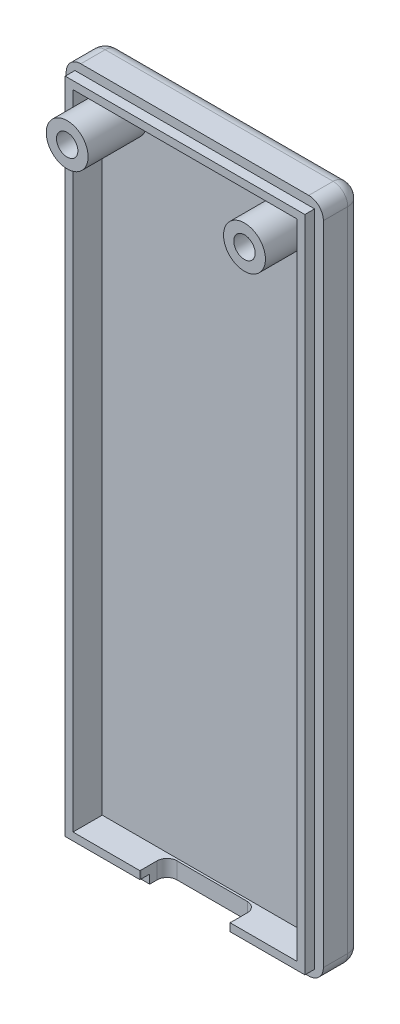
ISO-10303-21;
HEADER;
FILE_DESCRIPTION(('STEP AP214'),'2;1');
FILE_NAME('part.step','',(''),(''),'','','');
FILE_SCHEMA(('AUTOMOTIVE_DESIGN { 1 0 10303 214 1 1 1 1 }'));
ENDSEC;
DATA;
#1=APPLICATION_CONTEXT('core data for automotive mechanical design processes');
#2=APPLICATION_PROTOCOL_DEFINITION('international standard','automotive_design',2000,#1);
#3=PRODUCT_CONTEXT('',#1,'mechanical');
#4=PRODUCT('Part','Part','',(#3));
#5=PRODUCT_RELATED_PRODUCT_CATEGORY('part','',(#4));
#6=PRODUCT_DEFINITION_FORMATION('','',#4);
#7=PRODUCT_DEFINITION_CONTEXT('part definition',#1,'design');
#8=PRODUCT_DEFINITION('design','',#6,#7);
#9=PRODUCT_DEFINITION_SHAPE('','',#8);
#10=(LENGTH_UNIT() NAMED_UNIT(*) SI_UNIT(.MILLI.,.METRE.));
#11=(NAMED_UNIT(*) PLANE_ANGLE_UNIT() SI_UNIT($,.RADIAN.));
#12=(NAMED_UNIT(*) SI_UNIT($,.STERADIAN.) SOLID_ANGLE_UNIT());
#13=UNCERTAINTY_MEASURE_WITH_UNIT(LENGTH_MEASURE(1.E-05),#10,'distance_accuracy_value','');
#14=(GEOMETRIC_REPRESENTATION_CONTEXT(3) GLOBAL_UNCERTAINTY_ASSIGNED_CONTEXT((#13)) GLOBAL_UNIT_ASSIGNED_CONTEXT((#10,
#11,#12)) REPRESENTATION_CONTEXT('',''));
#15=CARTESIAN_POINT('',(0.,0.,0.));
#16=DIRECTION('',(0.,0.,1.));
#17=DIRECTION('',(1.,0.,0.));
#18=AXIS2_PLACEMENT_3D('',#15,#16,#17);
#19=CARTESIAN_POINT('',(0.,-69.4,5.));
#20=DIRECTION('',(0.,1.,0.));
#21=DIRECTION('',(0.,0.,1.));
#22=AXIS2_PLACEMENT_3D('',#19,#20,#21);
#23=PLANE('',#22);
#24=DIRECTION('',(1.,0.,0.));
#25=VECTOR('',#24,1.);
#26=CARTESIAN_POINT('',(0.,-69.4,1.5));
#27=LINE('',#26,#25);
#28=CARTESIAN_POINT('',(1.50000000000001,-69.4,1.5));
#29=VERTEX_POINT('',#28);
#30=CARTESIAN_POINT('',(24.9,-69.4,1.5));
#31=VERTEX_POINT('',#30);
#32=EDGE_CURVE('E462',#29,#31,#27,.T.);
#33=ORIENTED_EDGE('',*,*,#32,.T.);
#34=DIRECTION('',(0.,0.,-1.));
#35=VECTOR('',#34,1.);
#36=CARTESIAN_POINT('',(24.9,-69.4,4.));
#37=LINE('',#36,#35);
#38=CARTESIAN_POINT('',(24.9,-69.4,4.));
#39=VERTEX_POINT('',#38);
#40=EDGE_CURVE('E464',#31,#39,#37,.F.);
#41=ORIENTED_EDGE('',*,*,#40,.T.);
#42=DIRECTION('',(1.,0.,0.));
#43=VECTOR('',#42,1.);
#44=CARTESIAN_POINT('',(0.,-69.4,4.));
#45=LINE('',#44,#43);
#46=CARTESIAN_POINT('',(17.8278234644786,-69.4,4.));
#47=VERTEX_POINT('',#46);
#48=EDGE_CURVE('E309',#47,#39,#45,.T.);
#49=ORIENTED_EDGE('',*,*,#48,.F.);
#50=DIRECTION('',(0.,0.,1.));
#51=VECTOR('',#50,1.);
#52=CARTESIAN_POINT('',(17.8278234644786,-69.4,0.));
#53=LINE('',#52,#51);
#54=CARTESIAN_POINT('',(17.8278234644786,-69.4,3.23600203200449));
#55=VERTEX_POINT('',#54);
#56=EDGE_CURVE('E338',#55,#47,#53,.T.);
#57=ORIENTED_EDGE('',*,*,#56,.F.);
#58=CARTESIAN_POINT('',(16.8118214324742,-69.4,3.23600203200449));
#59=DIRECTION('',(0.,-1.,0.));
#60=DIRECTION('',(0.,0.,-1.));
#61=AXIS2_PLACEMENT_3D('',#58,#59,#60);
#62=CIRCLE('',#61,1.01600203200449);
#63=CARTESIAN_POINT('',(16.8118214324742,-69.4,2.22));
#64=VERTEX_POINT('',#63);
#65=EDGE_CURVE('E335',#64,#55,#62,.T.);
#66=ORIENTED_EDGE('',*,*,#65,.F.);
#67=DIRECTION('',(1.,0.,0.));
#68=VECTOR('',#67,1.);
#69=CARTESIAN_POINT('',(0.,-69.4,2.22));
#70=LINE('',#69,#68);
#71=CARTESIAN_POINT('',(9.58817856752611,-69.4,2.22));
#72=VERTEX_POINT('',#71);
#73=EDGE_CURVE('E332',#72,#64,#70,.T.);
#74=ORIENTED_EDGE('',*,*,#73,.F.);
#75=CARTESIAN_POINT('',(9.58817856752611,-69.4,3.23600203200474));
#76=DIRECTION('',(0.,-1.,0.));
#77=DIRECTION('',(0.,0.,-1.));
#78=AXIS2_PLACEMENT_3D('',#75,#76,#77);
#79=CIRCLE('',#78,1.01600203200474);
#80=CARTESIAN_POINT('',(8.57217653552137,-69.4,3.23600203200474));
#81=VERTEX_POINT('',#80);
#82=EDGE_CURVE('E329',#81,#72,#79,.T.);
#83=ORIENTED_EDGE('',*,*,#82,.F.);
#84=DIRECTION('',(0.,0.,1.));
#85=VECTOR('',#84,1.);
#86=CARTESIAN_POINT('',(8.57217653552137,-69.4,0.));
#87=LINE('',#86,#85);
#88=CARTESIAN_POINT('',(8.57217653552137,-69.4,4.));
#89=VERTEX_POINT('',#88);
#90=EDGE_CURVE('E326',#81,#89,#87,.T.);
#91=ORIENTED_EDGE('',*,*,#90,.T.);
#92=CARTESIAN_POINT('',(1.50000000000001,-69.4,4.));
#93=VERTEX_POINT('',#92);
#94=EDGE_CURVE('E310',#93,#89,#45,.T.);
#95=ORIENTED_EDGE('',*,*,#94,.F.);
#96=DIRECTION('',(0.,0.,-1.));
#97=VECTOR('',#96,1.);
#98=CARTESIAN_POINT('',(1.50000000000001,-69.4,5.));
#99=LINE('',#98,#97);
#100=EDGE_CURVE('E460',#93,#29,#99,.T.);
#101=ORIENTED_EDGE('',*,*,#100,.T.);
#102=EDGE_LOOP('',(#33,#41,#49,#57,#66,#74,#83,#91,#95,#101));
#103=FACE_BOUND('',#102,.T.);
#104=ADVANCED_FACE('F73',(#103),#23,.F.);
#105=CARTESIAN_POINT('',(0.,0.,5.));
#106=DIRECTION('',(0.,0.,1.));
#107=DIRECTION('',(1.,0.,0.));
#108=AXIS2_PLACEMENT_3D('',#105,#106,#107);
#109=PLANE('',#108);
#110=DIRECTION('',(0.,-1.,0.));
#111=VECTOR('',#110,1.);
#112=CARTESIAN_POINT('',(0.9,-0.9,5.));
#113=LINE('',#112,#111);
#114=CARTESIAN_POINT('',(0.9,-0.9,5.));
#115=VERTEX_POINT('',#114);
#116=CARTESIAN_POINT('',(0.900000000000008,-68.5,5.));
#117=VERTEX_POINT('',#116);
#118=EDGE_CURVE('E296',#115,#117,#113,.T.);
#119=ORIENTED_EDGE('',*,*,#118,.T.);
#120=DIRECTION('',(1.,0.,0.));
#121=VECTOR('',#120,1.);
#122=CARTESIAN_POINT('',(0.900000000000008,-68.5,5.));
#123=LINE('',#122,#121);
#124=CARTESIAN_POINT('',(8.58272340286901,-68.5,5.));
#125=VERTEX_POINT('',#124);
#126=EDGE_CURVE('E265',#117,#125,#123,.T.);
#127=ORIENTED_EDGE('',*,*,#126,.T.);
#128=DIRECTION('',(0.,-1.,0.));
#129=VECTOR('',#128,1.);
#130=CARTESIAN_POINT('',(8.58272340286901,-59.4,5.));
#131=LINE('',#130,#129);
#132=CARTESIAN_POINT('',(8.58272340286901,-67.7,5.));
#133=VERTEX_POINT('',#132);
#134=EDGE_CURVE('E429',#133,#125,#131,.T.);
#135=ORIENTED_EDGE('',*,*,#134,.F.);
#136=DIRECTION('',(1.,0.,0.));
#137=VECTOR('',#136,1.);
#138=CARTESIAN_POINT('',(0.,-67.7,5.));
#139=LINE('',#138,#137);
#140=CARTESIAN_POINT('',(1.70000000000001,-67.7,5.));
#141=VERTEX_POINT('',#140);
#142=EDGE_CURVE('E406',#141,#133,#139,.T.);
#143=ORIENTED_EDGE('',*,*,#142,.F.);
#144=DIRECTION('',(0.,-1.,0.));
#145=VECTOR('',#144,1.);
#146=CARTESIAN_POINT('',(1.7,0.,5.));
#147=LINE('',#146,#145);
#148=CARTESIAN_POINT('',(1.7,-1.7,5.));
#149=VERTEX_POINT('',#148);
#150=EDGE_CURVE('E409',#149,#141,#147,.T.);
#151=ORIENTED_EDGE('',*,*,#150,.F.);
#152=DIRECTION('',(1.,0.,0.));
#153=VECTOR('',#152,1.);
#154=CARTESIAN_POINT('',(0.,-1.7,5.));
#155=LINE('',#154,#153);
#156=CARTESIAN_POINT('',(24.7,-1.7,5.));
#157=VERTEX_POINT('',#156);
#158=EDGE_CURVE('E399',#149,#157,#155,.T.);
#159=ORIENTED_EDGE('',*,*,#158,.T.);
#160=DIRECTION('',(0.,-1.,0.));
#161=VECTOR('',#160,1.);
#162=CARTESIAN_POINT('',(24.7,0.,5.));
#163=LINE('',#162,#161);
#164=CARTESIAN_POINT('',(24.7,-67.7,5.));
#165=VERTEX_POINT('',#164);
#166=EDGE_CURVE('E402',#157,#165,#163,.T.);
#167=ORIENTED_EDGE('',*,*,#166,.T.);
#168=CARTESIAN_POINT('',(17.8014412147156,-67.7,5.));
#169=VERTEX_POINT('',#168);
#170=EDGE_CURVE('E405',#169,#165,#139,.T.);
#171=ORIENTED_EDGE('',*,*,#170,.F.);
#172=DIRECTION('',(0.,-1.,0.));
#173=VECTOR('',#172,1.);
#174=CARTESIAN_POINT('',(17.8014412147156,-59.4,5.));
#175=LINE('',#174,#173);
#176=CARTESIAN_POINT('',(17.8014412147156,-68.5,5.));
#177=VERTEX_POINT('',#176);
#178=EDGE_CURVE('E432',#169,#177,#175,.T.);
#179=ORIENTED_EDGE('',*,*,#178,.T.);
#180=CARTESIAN_POINT('',(25.5,-68.5,5.));
#181=VERTEX_POINT('',#180);
#182=EDGE_CURVE('E298',#177,#181,#123,.T.);
#183=ORIENTED_EDGE('',*,*,#182,.T.);
#184=DIRECTION('',(0.,1.,0.));
#185=VECTOR('',#184,1.);
#186=CARTESIAN_POINT('',(25.5,-0.9,5.));
#187=LINE('',#186,#185);
#188=CARTESIAN_POINT('',(25.5,-0.9,5.));
#189=VERTEX_POINT('',#188);
#190=EDGE_CURVE('E290',#181,#189,#187,.T.);
#191=ORIENTED_EDGE('',*,*,#190,.T.);
#192=DIRECTION('',(-1.,0.,0.));
#193=VECTOR('',#192,1.);
#194=CARTESIAN_POINT('',(0.9,-0.9,5.));
#195=LINE('',#194,#193);
#196=EDGE_CURVE('E287',#189,#115,#195,.T.);
#197=ORIENTED_EDGE('',*,*,#196,.T.);
#198=EDGE_LOOP('',(#119,#127,#135,#143,#151,#159,#167,#171,#179,#183,#191,#197));
#199=FACE_BOUND('',#198,.T.);
#200=ADVANCED_FACE('F575',(#199),#109,.T.);
#201=CARTESIAN_POINT('',(26.4,0.,5.));
#202=DIRECTION('',(1.,0.,0.));
#203=DIRECTION('',(0.,1.,0.));
#204=AXIS2_PLACEMENT_3D('',#201,#202,#203);
#205=PLANE('',#204);
#206=DIRECTION('',(0.,-1.,0.));
#207=VECTOR('',#206,1.);
#208=CARTESIAN_POINT('',(26.4,0.,1.5));
#209=LINE('',#208,#207);
#210=CARTESIAN_POINT('',(26.4,-67.9,1.5));
#211=VERTEX_POINT('',#210);
#212=CARTESIAN_POINT('',(26.4,-1.5,1.5));
#213=VERTEX_POINT('',#212);
#214=EDGE_CURVE('E90',#211,#213,#209,.F.);
#215=ORIENTED_EDGE('',*,*,#214,.T.);
#216=DIRECTION('',(0.,0.,-1.));
#217=VECTOR('',#216,1.);
#218=CARTESIAN_POINT('',(26.4,-1.5,5.));
#219=LINE('',#218,#217);
#220=CARTESIAN_POINT('',(26.4,-1.5,4.));
#221=VERTEX_POINT('',#220);
#222=EDGE_CURVE('E468',#213,#221,#219,.F.);
#223=ORIENTED_EDGE('',*,*,#222,.T.);
#224=DIRECTION('',(0.,1.,0.));
#225=VECTOR('',#224,1.);
#226=CARTESIAN_POINT('',(26.4,0.,4.));
#227=LINE('',#226,#225);
#228=CARTESIAN_POINT('',(26.4,-67.9,4.));
#229=VERTEX_POINT('',#228);
#230=EDGE_CURVE('E312',#229,#221,#227,.T.);
#231=ORIENTED_EDGE('',*,*,#230,.F.);
#232=DIRECTION('',(0.,0.,-1.));
#233=VECTOR('',#232,1.);
#234=CARTESIAN_POINT('',(26.4,-67.9,0.));
#235=LINE('',#234,#233);
#236=EDGE_CURVE('E95',#229,#211,#235,.T.);
#237=ORIENTED_EDGE('',*,*,#236,.T.);
#238=EDGE_LOOP('',(#215,#223,#231,#237));
#239=FACE_BOUND('',#238,.T.);
#240=ADVANCED_FACE('F539',(#239),#205,.T.);
#241=CARTESIAN_POINT('',(0.,0.,5.));
#242=DIRECTION('',(0.,1.,0.));
#243=DIRECTION('',(-1.,0.,0.));
#244=AXIS2_PLACEMENT_3D('',#241,#242,#243);
#245=PLANE('',#244);
#246=DIRECTION('',(1.,0.,0.));
#247=VECTOR('',#246,1.);
#248=CARTESIAN_POINT('',(0.,0.,1.5));
#249=LINE('',#248,#247);
#250=CARTESIAN_POINT('',(24.9,0.,1.5));
#251=VERTEX_POINT('',#250);
#252=CARTESIAN_POINT('',(1.5,0.,1.5));
#253=VERTEX_POINT('',#252);
#254=EDGE_CURVE('E449',#251,#253,#249,.F.);
#255=ORIENTED_EDGE('',*,*,#254,.T.);
#256=DIRECTION('',(0.,0.,-1.));
#257=VECTOR('',#256,1.);
#258=CARTESIAN_POINT('',(1.5,0.,4.));
#259=LINE('',#258,#257);
#260=CARTESIAN_POINT('',(1.5,0.,4.));
#261=VERTEX_POINT('',#260);
#262=EDGE_CURVE('E452',#253,#261,#259,.F.);
#263=ORIENTED_EDGE('',*,*,#262,.T.);
#264=DIRECTION('',(-1.,0.,0.));
#265=VECTOR('',#264,1.);
#266=CARTESIAN_POINT('',(0.,0.,4.));
#267=LINE('',#266,#265);
#268=CARTESIAN_POINT('',(24.9,0.,4.));
#269=VERTEX_POINT('',#268);
#270=EDGE_CURVE('E315',#269,#261,#267,.T.);
#271=ORIENTED_EDGE('',*,*,#270,.F.);
#272=DIRECTION('',(0.,0.,-1.));
#273=VECTOR('',#272,1.);
#274=CARTESIAN_POINT('',(24.9,0.,5.));
#275=LINE('',#274,#273);
#276=EDGE_CURVE('E447',#269,#251,#275,.T.);
#277=ORIENTED_EDGE('',*,*,#276,.T.);
#278=EDGE_LOOP('',(#255,#263,#271,#277));
#279=FACE_BOUND('',#278,.T.);
#280=ADVANCED_FACE('F554',(#279),#245,.T.);
#281=CARTESIAN_POINT('',(0.,0.,5.));
#282=DIRECTION('',(1.,0.,0.));
#283=DIRECTION('',(0.,1.,0.));
#284=AXIS2_PLACEMENT_3D('',#281,#282,#283);
#285=PLANE('',#284);
#286=DIRECTION('',(0.,-1.,0.));
#287=VECTOR('',#286,1.);
#288=CARTESIAN_POINT('',(0.,0.,4.));
#289=LINE('',#288,#287);
#290=CARTESIAN_POINT('',(0.,-1.5,4.));
#291=VERTEX_POINT('',#290);
#292=CARTESIAN_POINT('',(0.,-67.9,4.));
#293=VERTEX_POINT('',#292);
#294=EDGE_CURVE('E303',#291,#293,#289,.T.);
#295=ORIENTED_EDGE('',*,*,#294,.F.);
#296=DIRECTION('',(0.,0.,-1.));
#297=VECTOR('',#296,1.);
#298=CARTESIAN_POINT('',(0.,-1.5,0.));
#299=LINE('',#298,#297);
#300=CARTESIAN_POINT('',(0.,-1.5,1.5));
#301=VERTEX_POINT('',#300);
#302=EDGE_CURVE('E458',#291,#301,#299,.T.);
#303=ORIENTED_EDGE('',*,*,#302,.T.);
#304=DIRECTION('',(0.,-1.,0.));
#305=VECTOR('',#304,1.);
#306=CARTESIAN_POINT('',(0.,0.,1.5));
#307=LINE('',#306,#305);
#308=CARTESIAN_POINT('',(0.,-67.9,1.5));
#309=VERTEX_POINT('',#308);
#310=EDGE_CURVE('E456',#301,#309,#307,.T.);
#311=ORIENTED_EDGE('',*,*,#310,.T.);
#312=DIRECTION('',(0.,0.,-1.));
#313=VECTOR('',#312,1.);
#314=CARTESIAN_POINT('',(0.,-67.9,5.));
#315=LINE('',#314,#313);
#316=EDGE_CURVE('E454',#309,#293,#315,.F.);
#317=ORIENTED_EDGE('',*,*,#316,.T.);
#318=EDGE_LOOP('',(#295,#303,#311,#317));
#319=FACE_BOUND('',#318,.T.);
#320=ADVANCED_FACE('F563',(#319),#285,.F.);
#321=CARTESIAN_POINT('',(16.8110675974635,-59.4,4.76964850640639));
#322=DIRECTION('',(0.,-1.,0.));
#323=DIRECTION('',(0.,0.,-1.));
#324=AXIS2_PLACEMENT_3D('',#321,#322,#323);
#325=CYLINDRICAL_SURFACE('',#324,1.01680957526458);
#326=DIRECTION('',(0.,-1.,0.));
#327=VECTOR('',#326,1.);
#328=CARTESIAN_POINT('',(17.8278234644786,-59.4,4.78009930733569));
#329=LINE('',#328,#327);
#330=CARTESIAN_POINT('',(17.8278234644786,-67.7,4.78009930733569));
#331=VERTEX_POINT('',#330);
#332=CARTESIAN_POINT('',(17.8278234644786,-68.5,4.78009930733569));
#333=VERTEX_POINT('',#332);
#334=EDGE_CURVE('E342',#331,#333,#329,.T.);
#335=ORIENTED_EDGE('',*,*,#334,.T.);
#336=CARTESIAN_POINT('',(16.8110675974635,-68.5,4.76964850640639));
#337=DIRECTION('',(0.,-1.,0.));
#338=DIRECTION('',(0.,0.,-1.));
#339=AXIS2_PLACEMENT_3D('',#336,#337,#338);
#340=CIRCLE('',#339,1.01680957526458);
#341=EDGE_CURVE('E321',#333,#177,#340,.T.);
#342=ORIENTED_EDGE('',*,*,#341,.T.);
#343=ORIENTED_EDGE('',*,*,#178,.F.);
#344=CARTESIAN_POINT('',(16.8110675974635,-67.7,4.76964850640639));
#345=DIRECTION('',(0.,1.,0.));
#346=DIRECTION('',(0.,0.,1.));
#347=AXIS2_PLACEMENT_3D('',#344,#345,#346);
#348=CIRCLE('',#347,1.01680957526458);
#349=EDGE_CURVE('E357',#331,#169,#348,.F.);
#350=ORIENTED_EDGE('',*,*,#349,.F.);
#351=EDGE_LOOP('',(#335,#342,#343,#350));
#352=FACE_BOUND('',#351,.T.);
#353=ADVANCED_FACE('F589',(#352),#325,.F.);
#354=CARTESIAN_POINT('',(17.8278234644786,-59.4,0.));
#355=DIRECTION('',(1.,0.,0.));
#356=DIRECTION('',(0.,0.,-1.));
#357=AXIS2_PLACEMENT_3D('',#354,#355,#356);
#358=PLANE('',#357);
#359=DIRECTION('',(0.,-1.,0.));
#360=VECTOR('',#359,1.);
#361=CARTESIAN_POINT('',(17.8278234644786,-59.4,4.));
#362=LINE('',#361,#360);
#363=CARTESIAN_POINT('',(17.8278234644786,-68.5,4.));
#364=VERTEX_POINT('',#363);
#365=EDGE_CURVE('E324',#364,#47,#362,.T.);
#366=ORIENTED_EDGE('',*,*,#365,.F.);
#367=DIRECTION('',(0.,0.,-1.));
#368=VECTOR('',#367,1.);
#369=CARTESIAN_POINT('',(17.8278234644786,-68.5,0.));
#370=LINE('',#369,#368);
#371=EDGE_CURVE('E319',#333,#364,#370,.T.);
#372=ORIENTED_EDGE('',*,*,#371,.F.);
#373=ORIENTED_EDGE('',*,*,#334,.F.);
#374=DIRECTION('',(0.,0.,-1.));
#375=VECTOR('',#374,1.);
#376=CARTESIAN_POINT('',(17.8278234644786,-67.7,5.));
#377=LINE('',#376,#375);
#378=CARTESIAN_POINT('',(17.8278234644786,-67.7,3.23600203200449));
#379=VERTEX_POINT('',#378);
#380=EDGE_CURVE('E369',#331,#379,#377,.T.);
#381=ORIENTED_EDGE('',*,*,#380,.T.);
#382=DIRECTION('',(0.,-1.,0.));
#383=VECTOR('',#382,1.);
#384=CARTESIAN_POINT('',(17.8278234644786,-59.4,3.23600203200449));
#385=LINE('',#384,#383);
#386=EDGE_CURVE('E346',#379,#55,#385,.T.);
#387=ORIENTED_EDGE('',*,*,#386,.T.);
#388=ORIENTED_EDGE('',*,*,#56,.T.);
#389=EDGE_LOOP('',(#366,#372,#373,#381,#387,#388));
#390=FACE_BOUND('',#389,.T.);
#391=ADVANCED_FACE('F762',(#390),#358,.F.);
#392=CARTESIAN_POINT('',(8.57217653552137,-59.4,0.));
#393=DIRECTION('',(1.,0.,0.));
#394=DIRECTION('',(0.,0.,-1.));
#395=AXIS2_PLACEMENT_3D('',#392,#393,#394);
#396=PLANE('',#395);
#397=DIRECTION('',(0.,0.,-1.));
#398=VECTOR('',#397,1.);
#399=CARTESIAN_POINT('',(8.57217653552137,-68.5,0.));
#400=LINE('',#399,#398);
#401=CARTESIAN_POINT('',(8.57217653552137,-68.5,4.90045473361375));
#402=VERTEX_POINT('',#401);
#403=CARTESIAN_POINT('',(8.57217653552137,-68.5,4.));
#404=VERTEX_POINT('',#403);
#405=EDGE_CURVE('E317',#402,#404,#400,.T.);
#406=ORIENTED_EDGE('',*,*,#405,.T.);
#407=DIRECTION('',(0.,-1.,0.));
#408=VECTOR('',#407,1.);
#409=CARTESIAN_POINT('',(8.57217653552137,-59.4,4.));
#410=LINE('',#409,#408);
#411=EDGE_CURVE('E281',#404,#89,#410,.T.);
#412=ORIENTED_EDGE('',*,*,#411,.T.);
#413=ORIENTED_EDGE('',*,*,#90,.F.);
#414=DIRECTION('',(0.,-1.,0.));
#415=VECTOR('',#414,1.);
#416=CARTESIAN_POINT('',(8.57217653552137,-59.4,3.23600203200474));
#417=LINE('',#416,#415);
#418=CARTESIAN_POINT('',(8.57217653552137,-67.7,3.23600203200474));
#419=VERTEX_POINT('',#418);
#420=EDGE_CURVE('E352',#419,#81,#417,.T.);
#421=ORIENTED_EDGE('',*,*,#420,.F.);
#422=DIRECTION('',(0.,0.,-1.));
#423=VECTOR('',#422,1.);
#424=CARTESIAN_POINT('',(8.57217653552137,-67.7,5.));
#425=LINE('',#424,#423);
#426=CARTESIAN_POINT('',(8.57217653552137,-67.7,4.90045473361375));
#427=VERTEX_POINT('',#426);
#428=EDGE_CURVE('E360',#427,#419,#425,.T.);
#429=ORIENTED_EDGE('',*,*,#428,.F.);
#430=DIRECTION('',(0.,-1.,0.));
#431=VECTOR('',#430,1.);
#432=CARTESIAN_POINT('',(8.57217653552137,-59.4,4.90045473361375));
#433=LINE('',#432,#431);
#434=EDGE_CURVE('E341',#427,#402,#433,.T.);
#435=ORIENTED_EDGE('',*,*,#434,.T.);
#436=EDGE_LOOP('',(#406,#412,#413,#421,#429,#435));
#437=FACE_BOUND('',#436,.T.);
#438=ADVANCED_FACE('F772',(#437),#396,.T.);
#439=CARTESIAN_POINT('',(9.58817856752637,-59.4,4.84314020095716));
#440=DIRECTION('',(0.,-1.,0.));
#441=DIRECTION('',(0.,0.,-1.));
#442=AXIS2_PLACEMENT_3D('',#439,#440,#441);
#443=CYLINDRICAL_SURFACE('',#442,1.01761735671712);
#444=CARTESIAN_POINT('',(9.58817856752637,-68.5,4.84314020095716));
#445=DIRECTION('',(0.,-1.,0.));
#446=DIRECTION('',(0.,0.,-1.));
#447=AXIS2_PLACEMENT_3D('',#444,#445,#446);
#448=CIRCLE('',#447,1.01761735671712);
#449=EDGE_CURVE('E435',#402,#125,#448,.F.);
#450=ORIENTED_EDGE('',*,*,#449,.F.);
#451=ORIENTED_EDGE('',*,*,#434,.F.);
#452=CARTESIAN_POINT('',(9.58817856752637,-67.7,4.84314020095716));
#453=DIRECTION('',(0.,1.,0.));
#454=DIRECTION('',(0.,0.,1.));
#455=AXIS2_PLACEMENT_3D('',#452,#453,#454);
#456=CIRCLE('',#455,1.01761735671712);
#457=EDGE_CURVE('E345',#427,#133,#456,.T.);
#458=ORIENTED_EDGE('',*,*,#457,.T.);
#459=ORIENTED_EDGE('',*,*,#134,.T.);
#460=EDGE_LOOP('',(#450,#451,#458,#459));
#461=FACE_BOUND('',#460,.T.);
#462=ADVANCED_FACE('F782',(#461),#443,.F.);
#463=CARTESIAN_POINT('',(0.,-67.7,5.));
#464=DIRECTION('',(0.,1.,0.));
#465=DIRECTION('',(0.,0.,1.));
#466=AXIS2_PLACEMENT_3D('',#463,#464,#465);
#467=PLANE('',#466);
#468=ORIENTED_EDGE('',*,*,#380,.F.);
#469=ORIENTED_EDGE('',*,*,#349,.T.);
#470=ORIENTED_EDGE('',*,*,#170,.T.);
#471=DIRECTION('',(0.,0.,-1.));
#472=VECTOR('',#471,1.);
#473=CARTESIAN_POINT('',(24.7,-67.7,5.));
#474=LINE('',#473,#472);
#475=CARTESIAN_POINT('',(24.7,-67.7,2.));
#476=VERTEX_POINT('',#475);
#477=EDGE_CURVE('E417',#165,#476,#474,.T.);
#478=ORIENTED_EDGE('',*,*,#477,.T.);
#479=DIRECTION('',(1.,0.,0.));
#480=VECTOR('',#479,1.);
#481=CARTESIAN_POINT('',(0.,-67.7,2.));
#482=LINE('',#481,#480);
#483=CARTESIAN_POINT('',(1.70000000000001,-67.7,2.));
#484=VERTEX_POINT('',#483);
#485=EDGE_CURVE('E389',#484,#476,#482,.T.);
#486=ORIENTED_EDGE('',*,*,#485,.F.);
#487=DIRECTION('',(0.,0.,-1.));
#488=VECTOR('',#487,1.);
#489=CARTESIAN_POINT('',(1.70000000000001,-67.7,5.));
#490=LINE('',#489,#488);
#491=EDGE_CURVE('E415',#141,#484,#490,.T.);
#492=ORIENTED_EDGE('',*,*,#491,.F.);
#493=ORIENTED_EDGE('',*,*,#142,.T.);
#494=ORIENTED_EDGE('',*,*,#457,.F.);
#495=ORIENTED_EDGE('',*,*,#428,.T.);
#496=CARTESIAN_POINT('',(9.58817856752611,-67.7,3.23600203200474));
#497=DIRECTION('',(0.,1.,0.));
#498=DIRECTION('',(0.,0.,1.));
#499=AXIS2_PLACEMENT_3D('',#496,#497,#498);
#500=CIRCLE('',#499,1.01600203200474);
#501=CARTESIAN_POINT('',(9.58817856752611,-67.7,2.22));
#502=VERTEX_POINT('',#501);
#503=EDGE_CURVE('E363',#502,#419,#500,.T.);
#504=ORIENTED_EDGE('',*,*,#503,.F.);
#505=DIRECTION('',(-1.,0.,0.));
#506=VECTOR('',#505,1.);
#507=CARTESIAN_POINT('',(0.,-67.7,2.22));
#508=LINE('',#507,#506);
#509=CARTESIAN_POINT('',(16.8118214324742,-67.7,2.22));
#510=VERTEX_POINT('',#509);
#511=EDGE_CURVE('E365',#510,#502,#508,.T.);
#512=ORIENTED_EDGE('',*,*,#511,.F.);
#513=CARTESIAN_POINT('',(16.8118214324742,-67.7,3.23600203200449));
#514=DIRECTION('',(0.,1.,0.));
#515=DIRECTION('',(0.,0.,1.));
#516=AXIS2_PLACEMENT_3D('',#513,#514,#515);
#517=CIRCLE('',#516,1.01600203200449);
#518=EDGE_CURVE('E367',#379,#510,#517,.T.);
#519=ORIENTED_EDGE('',*,*,#518,.F.);
#520=EDGE_LOOP('',(#468,#469,#470,#478,#486,#492,#493,#494,#495,#504,#512,#519));
#521=FACE_BOUND('',#520,.T.);
#522=ADVANCED_FACE('F792',(#521),#467,.T.);
#523=CARTESIAN_POINT('',(0.,-1.7,5.));
#524=DIRECTION('',(0.,1.,0.));
#525=DIRECTION('',(0.,0.,1.));
#526=AXIS2_PLACEMENT_3D('',#523,#524,#525);
#527=PLANE('',#526);
#528=DIRECTION('',(0.,0.,-1.));
#529=VECTOR('',#528,1.);
#530=CARTESIAN_POINT('',(1.7,-1.7,5.));
#531=LINE('',#530,#529);
#532=CARTESIAN_POINT('',(1.7,-1.7,2.));
#533=VERTEX_POINT('',#532);
#534=EDGE_CURVE('E412',#149,#533,#531,.T.);
#535=ORIENTED_EDGE('',*,*,#534,.T.);
#536=DIRECTION('',(1.,0.,0.));
#537=VECTOR('',#536,1.);
#538=CARTESIAN_POINT('',(0.,-1.7,2.));
#539=LINE('',#538,#537);
#540=CARTESIAN_POINT('',(24.7,-1.7,2.));
#541=VERTEX_POINT('',#540);
#542=EDGE_CURVE('E394',#533,#541,#539,.T.);
#543=ORIENTED_EDGE('',*,*,#542,.T.);
#544=DIRECTION('',(0.,0.,-1.));
#545=VECTOR('',#544,1.);
#546=CARTESIAN_POINT('',(24.7,-1.7,5.));
#547=LINE('',#546,#545);
#548=EDGE_CURVE('E420',#157,#541,#547,.T.);
#549=ORIENTED_EDGE('',*,*,#548,.F.);
#550=ORIENTED_EDGE('',*,*,#158,.F.);
#551=EDGE_LOOP('',(#535,#543,#549,#550));
#552=FACE_BOUND('',#551,.T.);
#553=ADVANCED_FACE('F585',(#552),#527,.F.);
#554=CARTESIAN_POINT('',(24.7,0.,5.));
#555=DIRECTION('',(1.,0.,0.));
#556=DIRECTION('',(0.,1.,0.));
#557=AXIS2_PLACEMENT_3D('',#554,#555,#556);
#558=PLANE('',#557);
#559=ORIENTED_EDGE('',*,*,#548,.T.);
#560=DIRECTION('',(0.,-1.,0.));
#561=VECTOR('',#560,1.);
#562=CARTESIAN_POINT('',(24.7,0.,2.));
#563=LINE('',#562,#561);
#564=EDGE_CURVE('E392',#541,#476,#563,.T.);
#565=ORIENTED_EDGE('',*,*,#564,.T.);
#566=ORIENTED_EDGE('',*,*,#477,.F.);
#567=ORIENTED_EDGE('',*,*,#166,.F.);
#568=EDGE_LOOP('',(#559,#565,#566,#567));
#569=FACE_BOUND('',#568,.T.);
#570=ADVANCED_FACE('F937',(#569),#558,.F.);
#571=CARTESIAN_POINT('',(1.7,0.,5.));
#572=DIRECTION('',(1.,0.,0.));
#573=DIRECTION('',(0.,1.,0.));
#574=AXIS2_PLACEMENT_3D('',#571,#572,#573);
#575=PLANE('',#574);
#576=DIRECTION('',(0.,-1.,0.));
#577=VECTOR('',#576,1.);
#578=CARTESIAN_POINT('',(1.7,0.,2.));
#579=LINE('',#578,#577);
#580=EDGE_CURVE('E396',#533,#484,#579,.T.);
#581=ORIENTED_EDGE('',*,*,#580,.F.);
#582=ORIENTED_EDGE('',*,*,#534,.F.);
#583=ORIENTED_EDGE('',*,*,#150,.T.);
#584=ORIENTED_EDGE('',*,*,#491,.T.);
#585=EDGE_LOOP('',(#581,#582,#583,#584));
#586=FACE_BOUND('',#585,.T.);
#587=ADVANCED_FACE('F928',(#586),#575,.T.);
#588=CARTESIAN_POINT('',(0.,0.,0.));
#589=DIRECTION('',(0.,0.,1.));
#590=DIRECTION('',(1.,0.,0.));
#591=AXIS2_PLACEMENT_3D('',#588,#589,#590);
#592=PLANE('',#591);
#593=DIRECTION('',(0.,-1.,0.));
#594=VECTOR('',#593,1.);
#595=CARTESIAN_POINT('',(1.5,0.,0.));
#596=LINE('',#595,#594);
#597=CARTESIAN_POINT('',(1.50000000000001,-67.9,0.));
#598=VERTEX_POINT('',#597);
#599=CARTESIAN_POINT('',(1.5,-1.5,0.));
#600=VERTEX_POINT('',#599);
#601=EDGE_CURVE('E442',#598,#600,#596,.F.);
#602=ORIENTED_EDGE('',*,*,#601,.T.);
#603=DIRECTION('',(1.,0.,0.));
#604=VECTOR('',#603,1.);
#605=CARTESIAN_POINT('',(26.4,-1.5,0.));
#606=LINE('',#605,#604);
#607=CARTESIAN_POINT('',(24.9,-1.5,0.));
#608=VERTEX_POINT('',#607);
#609=EDGE_CURVE('E444',#600,#608,#606,.T.);
#610=ORIENTED_EDGE('',*,*,#609,.T.);
#611=DIRECTION('',(0.,-1.,0.));
#612=VECTOR('',#611,1.);
#613=CARTESIAN_POINT('',(24.9,-69.4,0.));
#614=LINE('',#613,#612);
#615=CARTESIAN_POINT('',(24.9,-67.9,0.));
#616=VERTEX_POINT('',#615);
#617=EDGE_CURVE('E438',#608,#616,#614,.T.);
#618=ORIENTED_EDGE('',*,*,#617,.T.);
#619=DIRECTION('',(1.,0.,0.));
#620=VECTOR('',#619,1.);
#621=CARTESIAN_POINT('',(0.,-67.9,0.));
#622=LINE('',#621,#620);
#623=EDGE_CURVE('E440',#616,#598,#622,.F.);
#624=ORIENTED_EDGE('',*,*,#623,.T.);
#625=EDGE_LOOP('',(#602,#610,#618,#624));
#626=FACE_BOUND('',#625,.T.);
#627=ADVANCED_FACE('F521',(#626),#592,.F.);
#628=CARTESIAN_POINT('',(0.,0.,2.));
#629=DIRECTION('',(0.,0.,1.));
#630=DIRECTION('',(1.,0.,0.));
#631=AXIS2_PLACEMENT_3D('',#628,#629,#630);
#632=PLANE('',#631);
#633=CARTESIAN_POINT('',(22.3,-3.89999999999999,2.));
#634=DIRECTION('',(0.,0.,1.));
#635=DIRECTION('',(1.,0.,0.));
#636=AXIS2_PLACEMENT_3D('',#633,#634,#635);
#637=CIRCLE('',#636,2.15);
#638=CARTESIAN_POINT('',(24.45,-3.89999999999999,2.));
#639=VERTEX_POINT('',#638);
#640=EDGE_CURVE('E383',#639,#639,#637,.T.);
#641=ORIENTED_EDGE('',*,*,#640,.F.);
#642=EDGE_LOOP('',(#641));
#643=FACE_BOUND('',#642,.T.);
#644=CARTESIAN_POINT('',(4.09999999999999,-3.89999999999999,2.));
#645=DIRECTION('',(0.,0.,1.));
#646=DIRECTION('',(1.,0.,0.));
#647=AXIS2_PLACEMENT_3D('',#644,#645,#646);
#648=CIRCLE('',#647,2.15);
#649=CARTESIAN_POINT('',(6.24999999999999,-3.89999999999999,2.));
#650=VERTEX_POINT('',#649);
#651=EDGE_CURVE('E386',#650,#650,#648,.T.);
#652=ORIENTED_EDGE('',*,*,#651,.F.);
#653=EDGE_LOOP('',(#652));
#654=FACE_BOUND('',#653,.T.);
#655=ORIENTED_EDGE('',*,*,#485,.T.);
#656=ORIENTED_EDGE('',*,*,#564,.F.);
#657=ORIENTED_EDGE('',*,*,#542,.F.);
#658=ORIENTED_EDGE('',*,*,#580,.T.);
#659=EDGE_LOOP('',(#655,#656,#657,#658));
#660=FACE_BOUND('',#659,.T.);
#661=ADVANCED_FACE('F853',(#643,#654,#660),#632,.T.);
#662=CARTESIAN_POINT('',(22.3,-3.89999999999999,8.));
#663=DIRECTION('',(0.,0.,-1.));
#664=DIRECTION('',(-1.,0.,0.));
#665=AXIS2_PLACEMENT_3D('',#662,#663,#664);
#666=CYLINDRICAL_SURFACE('',#665,1.1);
#667=CARTESIAN_POINT('',(22.3,-3.89999999999999,2.));
#668=DIRECTION('',(0.,0.,1.));
#669=DIRECTION('',(1.,0.,0.));
#670=AXIS2_PLACEMENT_3D('',#667,#668,#669);
#671=CIRCLE('',#670,1.1);
#672=CARTESIAN_POINT('',(23.4,-3.89999999999999,2.));
#673=VERTEX_POINT('',#672);
#674=EDGE_CURVE('E426',#673,#673,#671,.T.);
#675=ORIENTED_EDGE('',*,*,#674,.F.);
#676=EDGE_LOOP('',(#675));
#677=FACE_BOUND('',#676,.T.);
#678=CARTESIAN_POINT('',(22.3,-3.89999999999999,8.));
#679=DIRECTION('',(0.,0.,1.));
#680=DIRECTION('',(1.,0.,0.));
#681=AXIS2_PLACEMENT_3D('',#678,#679,#680);
#682=CIRCLE('',#681,1.1);
#683=CARTESIAN_POINT('',(23.4,-3.89999999999999,8.));
#684=VERTEX_POINT('',#683);
#685=EDGE_CURVE('E377',#684,#684,#682,.T.);
#686=ORIENTED_EDGE('',*,*,#685,.T.);
#687=EDGE_LOOP('',(#686));
#688=FACE_BOUND('',#687,.T.);
#689=ADVANCED_FACE('F858',(#677,#688),#666,.F.);
#690=CARTESIAN_POINT('',(22.3,-3.89999999999999,8.));
#691=DIRECTION('',(0.,0.,-1.));
#692=DIRECTION('',(-1.,0.,0.));
#693=AXIS2_PLACEMENT_3D('',#690,#691,#692);
#694=CYLINDRICAL_SURFACE('',#693,2.15);
#695=ORIENTED_EDGE('',*,*,#640,.T.);
#696=EDGE_LOOP('',(#695));
#697=FACE_BOUND('',#696,.T.);
#698=CARTESIAN_POINT('',(22.3,-3.89999999999999,8.));
#699=DIRECTION('',(0.,0.,1.));
#700=DIRECTION('',(1.,0.,0.));
#701=AXIS2_PLACEMENT_3D('',#698,#699,#700);
#702=CIRCLE('',#701,2.15);
#703=CARTESIAN_POINT('',(24.45,-3.89999999999999,8.));
#704=VERTEX_POINT('',#703);
#705=EDGE_CURVE('E380',#704,#704,#702,.T.);
#706=ORIENTED_EDGE('',*,*,#705,.F.);
#707=EDGE_LOOP('',(#706));
#708=FACE_BOUND('',#707,.T.);
#709=ADVANCED_FACE('F901',(#697,#708),#694,.T.);
#710=CARTESIAN_POINT('',(0.,0.,8.));
#711=DIRECTION('',(0.,0.,1.));
#712=DIRECTION('',(1.,0.,0.));
#713=AXIS2_PLACEMENT_3D('',#710,#711,#712);
#714=PLANE('',#713);
#715=ORIENTED_EDGE('',*,*,#685,.F.);
#716=EDGE_LOOP('',(#715));
#717=FACE_BOUND('',#716,.T.);
#718=ORIENTED_EDGE('',*,*,#705,.T.);
#719=EDGE_LOOP('',(#718));
#720=FACE_BOUND('',#719,.T.);
#721=ADVANCED_FACE('F890',(#717,#720),#714,.T.);
#722=CARTESIAN_POINT('',(4.09999999999999,-3.89999999999999,8.));
#723=DIRECTION('',(0.,0.,-1.));
#724=DIRECTION('',(-1.,0.,0.));
#725=AXIS2_PLACEMENT_3D('',#722,#723,#724);
#726=CYLINDRICAL_SURFACE('',#725,1.1);
#727=CARTESIAN_POINT('',(4.09999999999999,-3.89999999999999,2.));
#728=DIRECTION('',(0.,0.,1.));
#729=DIRECTION('',(1.,0.,0.));
#730=AXIS2_PLACEMENT_3D('',#727,#728,#729);
#731=CIRCLE('',#730,1.1);
#732=CARTESIAN_POINT('',(5.19999999999999,-3.89999999999999,2.));
#733=VERTEX_POINT('',#732);
#734=EDGE_CURVE('E423',#733,#733,#731,.T.);
#735=ORIENTED_EDGE('',*,*,#734,.F.);
#736=EDGE_LOOP('',(#735));
#737=FACE_BOUND('',#736,.T.);
#738=CARTESIAN_POINT('',(4.09999999999999,-3.89999999999999,8.));
#739=DIRECTION('',(0.,0.,1.));
#740=DIRECTION('',(1.,0.,0.));
#741=AXIS2_PLACEMENT_3D('',#738,#739,#740);
#742=CIRCLE('',#741,1.1);
#743=CARTESIAN_POINT('',(5.19999999999999,-3.89999999999999,8.));
#744=VERTEX_POINT('',#743);
#745=EDGE_CURVE('E371',#744,#744,#742,.T.);
#746=ORIENTED_EDGE('',*,*,#745,.T.);
#747=EDGE_LOOP('',(#746));
#748=FACE_BOUND('',#747,.T.);
#749=ADVANCED_FACE('F880',(#737,#748),#726,.F.);
#750=CARTESIAN_POINT('',(4.09999999999999,-3.89999999999999,8.));
#751=DIRECTION('',(0.,0.,-1.));
#752=DIRECTION('',(-1.,0.,0.));
#753=AXIS2_PLACEMENT_3D('',#750,#751,#752);
#754=CYLINDRICAL_SURFACE('',#753,2.15);
#755=ORIENTED_EDGE('',*,*,#651,.T.);
#756=EDGE_LOOP('',(#755));
#757=FACE_BOUND('',#756,.T.);
#758=CARTESIAN_POINT('',(4.09999999999999,-3.89999999999999,8.));
#759=DIRECTION('',(0.,0.,1.));
#760=DIRECTION('',(1.,0.,0.));
#761=AXIS2_PLACEMENT_3D('',#758,#759,#760);
#762=CIRCLE('',#761,2.15);
#763=CARTESIAN_POINT('',(6.24999999999999,-3.89999999999999,8.));
#764=VERTEX_POINT('',#763);
#765=EDGE_CURVE('E374',#764,#764,#762,.T.);
#766=ORIENTED_EDGE('',*,*,#765,.F.);
#767=EDGE_LOOP('',(#766));
#768=FACE_BOUND('',#767,.T.);
#769=ADVANCED_FACE('F869',(#757,#768),#754,.T.);
#770=CARTESIAN_POINT('',(0.,0.,8.));
#771=DIRECTION('',(0.,0.,1.));
#772=DIRECTION('',(1.,0.,0.));
#773=AXIS2_PLACEMENT_3D('',#770,#771,#772);
#774=PLANE('',#773);
#775=ORIENTED_EDGE('',*,*,#745,.F.);
#776=EDGE_LOOP('',(#775));
#777=FACE_BOUND('',#776,.T.);
#778=ORIENTED_EDGE('',*,*,#765,.T.);
#779=EDGE_LOOP('',(#778));
#780=FACE_BOUND('',#779,.T.);
#781=ADVANCED_FACE('F847',(#777,#780),#774,.T.);
#782=CARTESIAN_POINT('',(0.,0.,2.));
#783=DIRECTION('',(0.,0.,1.));
#784=DIRECTION('',(1.,0.,0.));
#785=AXIS2_PLACEMENT_3D('',#782,#783,#784);
#786=PLANE('',#785);
#787=ORIENTED_EDGE('',*,*,#734,.T.);
#788=EDGE_LOOP('',(#787));
#789=FACE_BOUND('',#788,.T.);
#790=ADVANCED_FACE('F838',(#789),#786,.T.);
#791=CARTESIAN_POINT('',(0.,0.,2.));
#792=DIRECTION('',(0.,0.,1.));
#793=DIRECTION('',(1.,0.,0.));
#794=AXIS2_PLACEMENT_3D('',#791,#792,#793);
#795=PLANE('',#794);
#796=ORIENTED_EDGE('',*,*,#674,.T.);
#797=EDGE_LOOP('',(#796));
#798=FACE_BOUND('',#797,.T.);
#799=ADVANCED_FACE('F820',(#798),#795,.T.);
#800=CARTESIAN_POINT('',(16.8118214324742,-59.4,3.23600203200449));
#801=DIRECTION('',(0.,-1.,0.));
#802=DIRECTION('',(0.,0.,-1.));
#803=AXIS2_PLACEMENT_3D('',#800,#801,#802);
#804=CYLINDRICAL_SURFACE('',#803,1.01600203200449);
#805=ORIENTED_EDGE('',*,*,#518,.T.);
#806=DIRECTION('',(0.,-1.,0.));
#807=VECTOR('',#806,1.);
#808=CARTESIAN_POINT('',(16.8118214324742,-59.4,2.22));
#809=LINE('',#808,#807);
#810=EDGE_CURVE('E348',#510,#64,#809,.T.);
#811=ORIENTED_EDGE('',*,*,#810,.T.);
#812=ORIENTED_EDGE('',*,*,#65,.T.);
#813=ORIENTED_EDGE('',*,*,#386,.F.);
#814=EDGE_LOOP('',(#805,#811,#812,#813));
#815=FACE_BOUND('',#814,.T.);
#816=ADVANCED_FACE('F811',(#815),#804,.F.);
#817=CARTESIAN_POINT('',(0.,-59.4,2.22));
#818=DIRECTION('',(0.,0.,-1.));
#819=DIRECTION('',(-1.,0.,0.));
#820=AXIS2_PLACEMENT_3D('',#817,#818,#819);
#821=PLANE('',#820);
#822=ORIENTED_EDGE('',*,*,#511,.T.);
#823=DIRECTION('',(0.,-1.,0.));
#824=VECTOR('',#823,1.);
#825=CARTESIAN_POINT('',(9.58817856752611,-59.4,2.22));
#826=LINE('',#825,#824);
#827=EDGE_CURVE('E350',#502,#72,#826,.T.);
#828=ORIENTED_EDGE('',*,*,#827,.T.);
#829=ORIENTED_EDGE('',*,*,#73,.T.);
#830=ORIENTED_EDGE('',*,*,#810,.F.);
#831=EDGE_LOOP('',(#822,#828,#829,#830));
#832=FACE_BOUND('',#831,.T.);
#833=ADVANCED_FACE('F802',(#832),#821,.F.);
#834=CARTESIAN_POINT('',(9.58817856752611,-59.4,3.23600203200474));
#835=DIRECTION('',(0.,-1.,0.));
#836=DIRECTION('',(0.,0.,-1.));
#837=AXIS2_PLACEMENT_3D('',#834,#835,#836);
#838=CYLINDRICAL_SURFACE('',#837,1.01600203200474);
#839=ORIENTED_EDGE('',*,*,#503,.T.);
#840=ORIENTED_EDGE('',*,*,#420,.T.);
#841=ORIENTED_EDGE('',*,*,#82,.T.);
#842=ORIENTED_EDGE('',*,*,#827,.F.);
#843=EDGE_LOOP('',(#839,#840,#841,#842));
#844=FACE_BOUND('',#843,.T.);
#845=ADVANCED_FACE('F725',(#844),#838,.F.);
#846=CARTESIAN_POINT('',(0.,0.,4.));
#847=DIRECTION('',(0.,0.,1.));
#848=DIRECTION('',(1.,0.,0.));
#849=AXIS2_PLACEMENT_3D('',#846,#847,#848);
#850=PLANE('',#849);
#851=ORIENTED_EDGE('',*,*,#270,.T.);
#852=CARTESIAN_POINT('',(1.5,-1.5,4.));
#853=DIRECTION('',(0.,0.,1.));
#854=DIRECTION('',(1.,0.,0.));
#855=AXIS2_PLACEMENT_3D('',#852,#853,#854);
#856=CIRCLE('',#855,1.5);
#857=EDGE_CURVE('E12',#261,#291,#856,.T.);
#858=ORIENTED_EDGE('',*,*,#857,.T.);
#859=ORIENTED_EDGE('',*,*,#294,.T.);
#860=CARTESIAN_POINT('',(1.50000000000001,-67.9,4.));
#861=DIRECTION('',(0.,0.,1.));
#862=DIRECTION('',(1.,0.,0.));
#863=AXIS2_PLACEMENT_3D('',#860,#861,#862);
#864=CIRCLE('',#863,1.5);
#865=EDGE_CURVE('E470',#293,#93,#864,.T.);
#866=ORIENTED_EDGE('',*,*,#865,.T.);
#867=ORIENTED_EDGE('',*,*,#94,.T.);
#868=ORIENTED_EDGE('',*,*,#411,.F.);
#869=DIRECTION('',(1.,0.,0.));
#870=VECTOR('',#869,1.);
#871=CARTESIAN_POINT('',(0.900000000000008,-68.5,4.));
#872=LINE('',#871,#870);
#873=CARTESIAN_POINT('',(0.900000000000008,-68.5,4.));
#874=VERTEX_POINT('',#873);
#875=EDGE_CURVE('E262',#874,#404,#872,.T.);
#876=ORIENTED_EDGE('',*,*,#875,.F.);
#877=DIRECTION('',(0.,-1.,0.));
#878=VECTOR('',#877,1.);
#879=CARTESIAN_POINT('',(0.9,-0.9,4.));
#880=LINE('',#879,#878);
#881=CARTESIAN_POINT('',(0.9,-0.9,4.));
#882=VERTEX_POINT('',#881);
#883=EDGE_CURVE('E278',#882,#874,#880,.T.);
#884=ORIENTED_EDGE('',*,*,#883,.F.);
#885=DIRECTION('',(-1.,0.,0.));
#886=VECTOR('',#885,1.);
#887=CARTESIAN_POINT('',(0.9,-0.9,4.));
#888=LINE('',#887,#886);
#889=CARTESIAN_POINT('',(25.5,-0.9,4.));
#890=VERTEX_POINT('',#889);
#891=EDGE_CURVE('E271',#890,#882,#888,.T.);
#892=ORIENTED_EDGE('',*,*,#891,.F.);
#893=DIRECTION('',(0.,1.,0.));
#894=VECTOR('',#893,1.);
#895=CARTESIAN_POINT('',(25.5,-0.9,4.));
#896=LINE('',#895,#894);
#897=CARTESIAN_POINT('',(25.5,-68.5,4.));
#898=VERTEX_POINT('',#897);
#899=EDGE_CURVE('E282',#898,#890,#896,.T.);
#900=ORIENTED_EDGE('',*,*,#899,.F.);
#901=EDGE_CURVE('E283',#364,#898,#872,.T.);
#902=ORIENTED_EDGE('',*,*,#901,.F.);
#903=ORIENTED_EDGE('',*,*,#365,.T.);
#904=ORIENTED_EDGE('',*,*,#48,.T.);
#905=CARTESIAN_POINT('',(24.9,-67.9,4.));
#906=DIRECTION('',(0.,0.,1.));
#907=DIRECTION('',(1.,0.,0.));
#908=AXIS2_PLACEMENT_3D('',#905,#906,#907);
#909=CIRCLE('',#908,1.5);
#910=EDGE_CURVE('E472',#39,#229,#909,.T.);
#911=ORIENTED_EDGE('',*,*,#910,.T.);
#912=ORIENTED_EDGE('',*,*,#230,.T.);
#913=CARTESIAN_POINT('',(24.9,-1.5,4.));
#914=DIRECTION('',(0.,0.,1.));
#915=DIRECTION('',(1.,0.,0.));
#916=AXIS2_PLACEMENT_3D('',#913,#914,#915);
#917=CIRCLE('',#916,1.5);
#918=EDGE_CURVE('E82',#221,#269,#917,.T.);
#919=ORIENTED_EDGE('',*,*,#918,.T.);
#920=EDGE_LOOP('',(#851,#858,#859,#866,#867,#868,#876,#884,#892,#900,#902,#903,#904,#911,#912,#919));
#921=FACE_BOUND('',#920,.T.);
#922=ADVANCED_FACE('F276',(#921),#850,.T.);
#923=CARTESIAN_POINT('',(0.900000000000008,-68.5,4.));
#924=DIRECTION('',(0.,-1.,0.));
#925=DIRECTION('',(0.,0.,-1.));
#926=AXIS2_PLACEMENT_3D('',#923,#924,#925);
#927=PLANE('',#926);
#928=ORIENTED_EDGE('',*,*,#371,.T.);
#929=ORIENTED_EDGE('',*,*,#901,.T.);
#930=DIRECTION('',(0.,0.,1.));
#931=VECTOR('',#930,1.);
#932=CARTESIAN_POINT('',(25.5,-68.5,4.));
#933=LINE('',#932,#931);
#934=EDGE_CURVE('E270',#898,#181,#933,.T.);
#935=ORIENTED_EDGE('',*,*,#934,.T.);
#936=ORIENTED_EDGE('',*,*,#182,.F.);
#937=ORIENTED_EDGE('',*,*,#341,.F.);
#938=EDGE_LOOP('',(#928,#929,#935,#936,#937));
#939=FACE_BOUND('',#938,.T.);
#940=ADVANCED_FACE('F573',(#939),#927,.T.);
#941=CARTESIAN_POINT('',(0.9,-0.9,4.));
#942=DIRECTION('',(-1.,0.,0.));
#943=DIRECTION('',(0.,-1.,0.));
#944=AXIS2_PLACEMENT_3D('',#941,#942,#943);
#945=PLANE('',#944);
#946=ORIENTED_EDGE('',*,*,#118,.F.);
#947=DIRECTION('',(0.,0.,1.));
#948=VECTOR('',#947,1.);
#949=CARTESIAN_POINT('',(0.9,-0.9,4.));
#950=LINE('',#949,#948);
#951=EDGE_CURVE('E286',#882,#115,#950,.T.);
#952=ORIENTED_EDGE('',*,*,#951,.F.);
#953=ORIENTED_EDGE('',*,*,#883,.T.);
#954=DIRECTION('',(0.,0.,1.));
#955=VECTOR('',#954,1.);
#956=CARTESIAN_POINT('',(0.900000000000008,-68.5,4.));
#957=LINE('',#956,#955);
#958=EDGE_CURVE('E259',#874,#117,#957,.T.);
#959=ORIENTED_EDGE('',*,*,#958,.T.);
#960=EDGE_LOOP('',(#946,#952,#953,#959));
#961=FACE_BOUND('',#960,.T.);
#962=ADVANCED_FACE('F285',(#961),#945,.T.);
#963=CARTESIAN_POINT('',(0.9,-0.9,4.));
#964=DIRECTION('',(0.,1.,0.));
#965=DIRECTION('',(0.,0.,1.));
#966=AXIS2_PLACEMENT_3D('',#963,#964,#965);
#967=PLANE('',#966);
#968=ORIENTED_EDGE('',*,*,#196,.F.);
#969=DIRECTION('',(0.,0.,1.));
#970=VECTOR('',#969,1.);
#971=CARTESIAN_POINT('',(25.5,-0.9,4.));
#972=LINE('',#971,#970);
#973=EDGE_CURVE('E304',#890,#189,#972,.T.);
#974=ORIENTED_EDGE('',*,*,#973,.F.);
#975=ORIENTED_EDGE('',*,*,#891,.T.);
#976=ORIENTED_EDGE('',*,*,#951,.T.);
#977=EDGE_LOOP('',(#968,#974,#975,#976));
#978=FACE_BOUND('',#977,.T.);
#979=ADVANCED_FACE('F696',(#978),#967,.T.);
#980=CARTESIAN_POINT('',(25.5,-0.9,4.));
#981=DIRECTION('',(1.,0.,0.));
#982=DIRECTION('',(0.,1.,0.));
#983=AXIS2_PLACEMENT_3D('',#980,#981,#982);
#984=PLANE('',#983);
#985=ORIENTED_EDGE('',*,*,#190,.F.);
#986=ORIENTED_EDGE('',*,*,#934,.F.);
#987=ORIENTED_EDGE('',*,*,#899,.T.);
#988=ORIENTED_EDGE('',*,*,#973,.T.);
#989=EDGE_LOOP('',(#985,#986,#987,#988));
#990=FACE_BOUND('',#989,.T.);
#991=ADVANCED_FACE('F571',(#990),#984,.T.);
#992=ORIENTED_EDGE('',*,*,#449,.T.);
#993=ORIENTED_EDGE('',*,*,#126,.F.);
#994=ORIENTED_EDGE('',*,*,#958,.F.);
#995=ORIENTED_EDGE('',*,*,#875,.T.);
#996=ORIENTED_EDGE('',*,*,#405,.F.);
#997=EDGE_LOOP('',(#992,#993,#994,#995,#996));
#998=FACE_BOUND('',#997,.T.);
#999=ADVANCED_FACE('F261',(#998),#927,.T.);
#1000=CARTESIAN_POINT('',(1.50000000000001,-67.9,5.));
#1001=DIRECTION('',(0.,0.,-1.));
#1002=DIRECTION('',(-1.,0.,0.));
#1003=AXIS2_PLACEMENT_3D('',#1000,#1001,#1002);
#1004=CYLINDRICAL_SURFACE('',#1003,1.5);
#1005=ORIENTED_EDGE('',*,*,#865,.F.);
#1006=ORIENTED_EDGE('',*,*,#316,.F.);
#1007=CARTESIAN_POINT('',(1.50000000000001,-67.9,1.5));
#1008=DIRECTION('',(0.,0.,-1.));
#1009=DIRECTION('',(-1.,0.,0.));
#1010=AXIS2_PLACEMENT_3D('',#1007,#1008,#1009);
#1011=CIRCLE('',#1010,1.5);
#1012=EDGE_CURVE('E77',#29,#309,#1011,.T.);
#1013=ORIENTED_EDGE('',*,*,#1012,.F.);
#1014=ORIENTED_EDGE('',*,*,#100,.F.);
#1015=EDGE_LOOP('',(#1005,#1006,#1013,#1014));
#1016=FACE_BOUND('',#1015,.T.);
#1017=ADVANCED_FACE('F75',(#1016),#1004,.T.);
#1018=CARTESIAN_POINT('',(0.,-67.9,1.5));
#1019=DIRECTION('',(1.,0.,0.));
#1020=DIRECTION('',(0.,0.,-1.));
#1021=AXIS2_PLACEMENT_3D('',#1018,#1019,#1020);
#1022=CYLINDRICAL_SURFACE('',#1021,1.5);
#1023=CARTESIAN_POINT('',(24.9,-67.9,1.5));
#1024=DIRECTION('',(1.,0.,0.));
#1025=DIRECTION('',(0.,0.,-1.));
#1026=AXIS2_PLACEMENT_3D('',#1023,#1024,#1025);
#1027=CIRCLE('',#1026,1.5);
#1028=EDGE_CURVE('E500',#31,#616,#1027,.T.);
#1029=ORIENTED_EDGE('',*,*,#1028,.F.);
#1030=ORIENTED_EDGE('',*,*,#32,.F.);
#1031=CARTESIAN_POINT('',(1.50000000000001,-67.9,1.5));
#1032=DIRECTION('',(-1.,0.,0.));
#1033=DIRECTION('',(0.,0.,1.));
#1034=AXIS2_PLACEMENT_3D('',#1031,#1032,#1033);
#1035=CIRCLE('',#1034,1.5);
#1036=EDGE_CURVE('E502',#598,#29,#1035,.T.);
#1037=ORIENTED_EDGE('',*,*,#1036,.F.);
#1038=ORIENTED_EDGE('',*,*,#623,.F.);
#1039=EDGE_LOOP('',(#1029,#1030,#1037,#1038));
#1040=FACE_BOUND('',#1039,.T.);
#1041=ADVANCED_FACE('F528',(#1040),#1022,.T.);
#1042=CARTESIAN_POINT('',(24.9,-67.9,5.));
#1043=DIRECTION('',(0.,0.,1.));
#1044=DIRECTION('',(1.,0.,0.));
#1045=AXIS2_PLACEMENT_3D('',#1042,#1043,#1044);
#1046=CYLINDRICAL_SURFACE('',#1045,1.5);
#1047=ORIENTED_EDGE('',*,*,#910,.F.);
#1048=ORIENTED_EDGE('',*,*,#40,.F.);
#1049=CARTESIAN_POINT('',(24.9,-67.9,1.5));
#1050=DIRECTION('',(0.,0.,-1.));
#1051=DIRECTION('',(-1.,0.,0.));
#1052=AXIS2_PLACEMENT_3D('',#1049,#1050,#1051);
#1053=CIRCLE('',#1052,1.5);
#1054=EDGE_CURVE('E497',#211,#31,#1053,.T.);
#1055=ORIENTED_EDGE('',*,*,#1054,.F.);
#1056=ORIENTED_EDGE('',*,*,#236,.F.);
#1057=EDGE_LOOP('',(#1047,#1048,#1055,#1056));
#1058=FACE_BOUND('',#1057,.T.);
#1059=ADVANCED_FACE('F536',(#1058),#1046,.T.);
#1060=CARTESIAN_POINT('',(1.50000000000001,-67.9,1.5));
#1061=DIRECTION('',(0.,-1.,0.));
#1062=DIRECTION('',(0.,0.,-1.));
#1063=AXIS2_PLACEMENT_3D('',#1060,#1061,#1062);
#1064=SPHERICAL_SURFACE('',#1063,1.5);
#1065=ORIENTED_EDGE('',*,*,#1036,.T.);
#1066=ORIENTED_EDGE('',*,*,#1012,.T.);
#1067=CARTESIAN_POINT('',(1.50000000000001,-67.9,1.5));
#1068=DIRECTION('',(0.,-1.,0.));
#1069=DIRECTION('',(0.,0.,-1.));
#1070=AXIS2_PLACEMENT_3D('',#1067,#1068,#1069);
#1071=CIRCLE('',#1070,1.5);
#1072=EDGE_CURVE('E494',#598,#309,#1071,.F.);
#1073=ORIENTED_EDGE('',*,*,#1072,.F.);
#1074=EDGE_LOOP('',(#1065,#1066,#1073));
#1075=FACE_BOUND('',#1074,.T.);
#1076=ADVANCED_FACE('F509',(#1075),#1064,.T.);
#1077=CARTESIAN_POINT('',(24.9,-67.9,1.5));
#1078=DIRECTION('',(0.,-1.,0.));
#1079=DIRECTION('',(0.,0.,-1.));
#1080=AXIS2_PLACEMENT_3D('',#1077,#1078,#1079);
#1081=SPHERICAL_SURFACE('',#1080,1.5);
#1082=ORIENTED_EDGE('',*,*,#1054,.T.);
#1083=ORIENTED_EDGE('',*,*,#1028,.T.);
#1084=CARTESIAN_POINT('',(24.9,-67.9,1.5));
#1085=DIRECTION('',(0.,-1.,0.));
#1086=DIRECTION('',(0.,0.,-1.));
#1087=AXIS2_PLACEMENT_3D('',#1084,#1085,#1086);
#1088=CIRCLE('',#1087,1.5);
#1089=EDGE_CURVE('E491',#211,#616,#1088,.F.);
#1090=ORIENTED_EDGE('',*,*,#1089,.F.);
#1091=EDGE_LOOP('',(#1082,#1083,#1090));
#1092=FACE_BOUND('',#1091,.T.);
#1093=ADVANCED_FACE('F609',(#1092),#1081,.T.);
#1094=CARTESIAN_POINT('',(1.5,-1.5,5.));
#1095=DIRECTION('',(0.,0.,1.));
#1096=DIRECTION('',(1.,0.,0.));
#1097=AXIS2_PLACEMENT_3D('',#1094,#1095,#1096);
#1098=CYLINDRICAL_SURFACE('',#1097,1.5);
#1099=ORIENTED_EDGE('',*,*,#857,.F.);
#1100=ORIENTED_EDGE('',*,*,#262,.F.);
#1101=CARTESIAN_POINT('',(1.5,-1.5,1.5));
#1102=DIRECTION('',(0.,0.,-1.));
#1103=DIRECTION('',(-1.,0.,0.));
#1104=AXIS2_PLACEMENT_3D('',#1101,#1102,#1103);
#1105=CIRCLE('',#1104,1.5);
#1106=EDGE_CURVE('E488',#301,#253,#1105,.T.);
#1107=ORIENTED_EDGE('',*,*,#1106,.F.);
#1108=ORIENTED_EDGE('',*,*,#302,.F.);
#1109=EDGE_LOOP('',(#1099,#1100,#1107,#1108));
#1110=FACE_BOUND('',#1109,.T.);
#1111=ADVANCED_FACE('F561',(#1110),#1098,.T.);
#1112=CARTESIAN_POINT('',(1.5,0.,1.5));
#1113=DIRECTION('',(0.,-1.,0.));
#1114=DIRECTION('',(1.,0.,0.));
#1115=AXIS2_PLACEMENT_3D('',#1112,#1113,#1114);
#1116=CYLINDRICAL_SURFACE('',#1115,1.5);
#1117=ORIENTED_EDGE('',*,*,#1072,.T.);
#1118=ORIENTED_EDGE('',*,*,#310,.F.);
#1119=CARTESIAN_POINT('',(1.5,-1.5,1.5));
#1120=DIRECTION('',(0.,1.,0.));
#1121=DIRECTION('',(-1.,0.,0.));
#1122=AXIS2_PLACEMENT_3D('',#1119,#1120,#1121);
#1123=CIRCLE('',#1122,1.5);
#1124=EDGE_CURVE('E485',#600,#301,#1123,.T.);
#1125=ORIENTED_EDGE('',*,*,#1124,.F.);
#1126=ORIENTED_EDGE('',*,*,#601,.F.);
#1127=EDGE_LOOP('',(#1117,#1118,#1125,#1126));
#1128=FACE_BOUND('',#1127,.T.);
#1129=ADVANCED_FACE('F516',(#1128),#1116,.T.);
#1130=CARTESIAN_POINT('',(24.9,0.,1.5));
#1131=DIRECTION('',(0.,1.,0.));
#1132=DIRECTION('',(-1.,0.,0.));
#1133=AXIS2_PLACEMENT_3D('',#1130,#1131,#1132);
#1134=CYLINDRICAL_SURFACE('',#1133,1.5);
#1135=ORIENTED_EDGE('',*,*,#1089,.T.);
#1136=ORIENTED_EDGE('',*,*,#617,.F.);
#1137=CARTESIAN_POINT('',(24.9,-1.5,1.5));
#1138=DIRECTION('',(0.,1.,0.));
#1139=DIRECTION('',(-1.,0.,0.));
#1140=AXIS2_PLACEMENT_3D('',#1137,#1138,#1139);
#1141=CIRCLE('',#1140,1.5);
#1142=EDGE_CURVE('E482',#213,#608,#1141,.T.);
#1143=ORIENTED_EDGE('',*,*,#1142,.F.);
#1144=ORIENTED_EDGE('',*,*,#214,.F.);
#1145=EDGE_LOOP('',(#1135,#1136,#1143,#1144));
#1146=FACE_BOUND('',#1145,.T.);
#1147=ADVANCED_FACE('F547',(#1146),#1134,.T.);
#1148=CARTESIAN_POINT('',(24.9,-1.5,5.));
#1149=DIRECTION('',(0.,0.,-1.));
#1150=DIRECTION('',(-1.,0.,0.));
#1151=AXIS2_PLACEMENT_3D('',#1148,#1149,#1150);
#1152=CYLINDRICAL_SURFACE('',#1151,1.5);
#1153=ORIENTED_EDGE('',*,*,#918,.F.);
#1154=ORIENTED_EDGE('',*,*,#222,.F.);
#1155=CARTESIAN_POINT('',(24.9,-1.5,1.5));
#1156=DIRECTION('',(0.,0.,-1.));
#1157=DIRECTION('',(-1.,0.,0.));
#1158=AXIS2_PLACEMENT_3D('',#1155,#1156,#1157);
#1159=CIRCLE('',#1158,1.5);
#1160=EDGE_CURVE('E479',#251,#213,#1159,.T.);
#1161=ORIENTED_EDGE('',*,*,#1160,.F.);
#1162=ORIENTED_EDGE('',*,*,#276,.F.);
#1163=EDGE_LOOP('',(#1153,#1154,#1161,#1162));
#1164=FACE_BOUND('',#1163,.T.);
#1165=ADVANCED_FACE('F543',(#1164),#1152,.T.);
#1166=CARTESIAN_POINT('',(1.5,-1.5,1.5));
#1167=DIRECTION('',(-1.,0.,0.));
#1168=DIRECTION('',(0.,-1.,0.));
#1169=AXIS2_PLACEMENT_3D('',#1166,#1167,#1168);
#1170=SPHERICAL_SURFACE('',#1169,1.5);
#1171=ORIENTED_EDGE('',*,*,#1124,.T.);
#1172=ORIENTED_EDGE('',*,*,#1106,.T.);
#1173=CARTESIAN_POINT('',(1.5,-1.5,1.5));
#1174=DIRECTION('',(-1.,0.,0.));
#1175=DIRECTION('',(0.,0.,1.));
#1176=AXIS2_PLACEMENT_3D('',#1173,#1174,#1175);
#1177=CIRCLE('',#1176,1.5);
#1178=EDGE_CURVE('E477',#600,#253,#1177,.F.);
#1179=ORIENTED_EDGE('',*,*,#1178,.F.);
#1180=EDGE_LOOP('',(#1171,#1172,#1179));
#1181=FACE_BOUND('',#1180,.T.);
#1182=ADVANCED_FACE('F597',(#1181),#1170,.T.);
#1183=CARTESIAN_POINT('',(24.9,-1.5,1.5));
#1184=DIRECTION('',(1.,0.,0.));
#1185=DIRECTION('',(0.,1.,0.));
#1186=AXIS2_PLACEMENT_3D('',#1183,#1184,#1185);
#1187=SPHERICAL_SURFACE('',#1186,1.5);
#1188=ORIENTED_EDGE('',*,*,#1160,.T.);
#1189=ORIENTED_EDGE('',*,*,#1142,.T.);
#1190=CARTESIAN_POINT('',(24.9,-1.5,1.5));
#1191=DIRECTION('',(1.,0.,0.));
#1192=DIRECTION('',(0.,0.,-1.));
#1193=AXIS2_PLACEMENT_3D('',#1190,#1191,#1192);
#1194=CIRCLE('',#1193,1.5);
#1195=EDGE_CURVE('E475',#251,#608,#1194,.F.);
#1196=ORIENTED_EDGE('',*,*,#1195,.F.);
#1197=EDGE_LOOP('',(#1188,#1189,#1196));
#1198=FACE_BOUND('',#1197,.T.);
#1199=ADVANCED_FACE('F550',(#1198),#1187,.T.);
#1200=CARTESIAN_POINT('',(0.,-1.5,1.5));
#1201=DIRECTION('',(-1.,0.,0.));
#1202=DIRECTION('',(0.,-1.,0.));
#1203=AXIS2_PLACEMENT_3D('',#1200,#1201,#1202);
#1204=CYLINDRICAL_SURFACE('',#1203,1.5);
#1205=ORIENTED_EDGE('',*,*,#1178,.T.);
#1206=ORIENTED_EDGE('',*,*,#254,.F.);
#1207=ORIENTED_EDGE('',*,*,#1195,.T.);
#1208=ORIENTED_EDGE('',*,*,#609,.F.);
#1209=EDGE_LOOP('',(#1205,#1206,#1207,#1208));
#1210=FACE_BOUND('',#1209,.T.);
#1211=ADVANCED_FACE('F552',(#1210),#1204,.T.);
#1212=CLOSED_SHELL('',(#104,#200,#240,#280,#320,#353,#391,#438,#462,#522,#553,#570,#587,#627,
#661,#689,#709,#721,#749,#769,#781,#790,#799,#816,#833,#845,#922,#940,#962,#979,#991,#999,#1017,
#1041,#1059,#1076,#1093,#1111,#1129,#1147,#1165,#1182,#1199,#1211));
#1213=MANIFOLD_SOLID_BREP('B2',#1212);
#1214=ADVANCED_BREP_SHAPE_REPRESENTATION('',(#18,#1213),#14);
#1215=SHAPE_DEFINITION_REPRESENTATION(#9,#1214);
ENDSEC;
END-ISO-10303-21;
